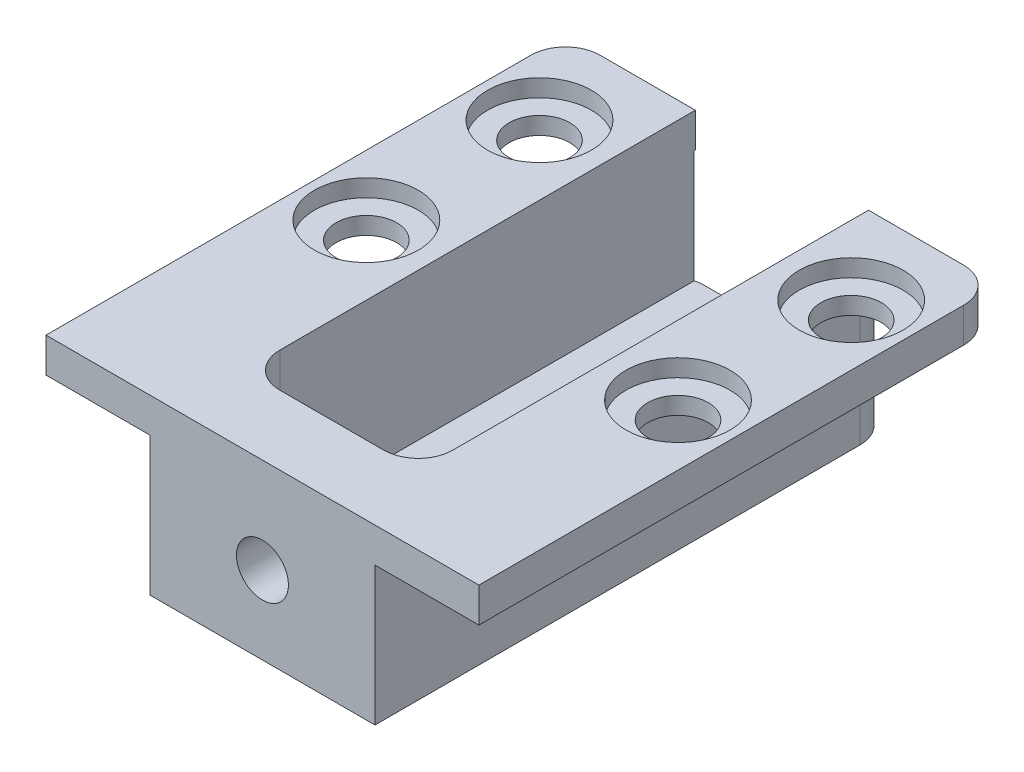
ISO-10303-21;
HEADER;
FILE_DESCRIPTION(('STEP AP214'),'2;1');
FILE_NAME('part.step','',(''),(''),'','','');
FILE_SCHEMA(('AUTOMOTIVE_DESIGN { 1 0 10303 214 1 1 1 1 }'));
ENDSEC;
DATA;
#1=APPLICATION_CONTEXT('core data for automotive mechanical design processes');
#2=APPLICATION_PROTOCOL_DEFINITION('international standard','automotive_design',2000,#1);
#3=PRODUCT_CONTEXT('',#1,'mechanical');
#4=PRODUCT('Part','Part','',(#3));
#5=PRODUCT_RELATED_PRODUCT_CATEGORY('part','',(#4));
#6=PRODUCT_DEFINITION_FORMATION('','',#4);
#7=PRODUCT_DEFINITION_CONTEXT('part definition',#1,'design');
#8=PRODUCT_DEFINITION('design','',#6,#7);
#9=PRODUCT_DEFINITION_SHAPE('','',#8);
#10=(LENGTH_UNIT() NAMED_UNIT(*) SI_UNIT(.MILLI.,.METRE.));
#11=(NAMED_UNIT(*) PLANE_ANGLE_UNIT() SI_UNIT($,.RADIAN.));
#12=(NAMED_UNIT(*) SI_UNIT($,.STERADIAN.) SOLID_ANGLE_UNIT());
#13=UNCERTAINTY_MEASURE_WITH_UNIT(LENGTH_MEASURE(1.E-05),#10,'distance_accuracy_value','');
#14=(GEOMETRIC_REPRESENTATION_CONTEXT(3) GLOBAL_UNCERTAINTY_ASSIGNED_CONTEXT((#13)) GLOBAL_UNIT_ASSIGNED_CONTEXT((#10,
#11,#12)) REPRESENTATION_CONTEXT('',''));
#15=CARTESIAN_POINT('',(0.,0.,0.));
#16=DIRECTION('',(0.,0.,1.));
#17=DIRECTION('',(1.,0.,0.));
#18=AXIS2_PLACEMENT_3D('',#15,#16,#17);
#19=CARTESIAN_POINT('',(-20.75,-6.,27.75));
#20=DIRECTION('',(0.,0.,1.));
#21=DIRECTION('',(1.,0.,0.));
#22=AXIS2_PLACEMENT_3D('',#19,#20,#21);
#23=PLANE('',#22);
#24=DIRECTION('',(1.,0.,0.));
#25=VECTOR('',#24,1.);
#26=CARTESIAN_POINT('',(-26.75,2.,27.75));
#27=LINE('',#26,#25);
#28=CARTESIAN_POINT('',(-28.25,2.,27.75));
#29=VERTEX_POINT('',#28);
#30=CARTESIAN_POINT('',(-22.75,2.,27.75));
#31=VERTEX_POINT('',#30);
#32=EDGE_CURVE('E667',#29,#31,#27,.T.);
#33=ORIENTED_EDGE('',*,*,#32,.F.);
#34=DIRECTION('',(0.,-1.,0.));
#35=VECTOR('',#34,1.);
#36=CARTESIAN_POINT('',(-28.25,4.,27.75));
#37=LINE('',#36,#35);
#38=CARTESIAN_POINT('',(-28.25,4.,27.75));
#39=VERTEX_POINT('',#38);
#40=EDGE_CURVE('E619',#39,#29,#37,.T.);
#41=ORIENTED_EDGE('',*,*,#40,.F.);
#42=DIRECTION('',(1.,0.,0.));
#43=VECTOR('',#42,1.);
#44=CARTESIAN_POINT('',(-20.75,4.,27.75));
#45=LINE('',#44,#43);
#46=CARTESIAN_POINT('',(-22.75,4.,27.75));
#47=VERTEX_POINT('',#46);
#48=EDGE_CURVE('E675',#39,#47,#45,.T.);
#49=ORIENTED_EDGE('',*,*,#48,.T.);
#50=DIRECTION('',(0.,1.,0.));
#51=VECTOR('',#50,1.);
#52=CARTESIAN_POINT('',(-22.75,2.,27.75));
#53=LINE('',#52,#51);
#54=EDGE_CURVE('E805',#47,#31,#53,.F.);
#55=ORIENTED_EDGE('',*,*,#54,.T.);
#56=EDGE_LOOP('',(#33,#41,#49,#55));
#57=FACE_BOUND('',#56,.T.);
#58=ADVANCED_FACE('F466',(#57),#23,.F.);
#59=DIRECTION('',(-1.,0.,0.));
#60=VECTOR('',#59,1.);
#61=CARTESIAN_POINT('',(-38.25,-4.5,27.75));
#62=LINE('',#61,#60);
#63=CARTESIAN_POINT('',(-28.75,-4.5,27.75));
#64=VERTEX_POINT('',#63);
#65=CARTESIAN_POINT('',(-37.75,-4.5,27.75));
#66=VERTEX_POINT('',#65);
#67=EDGE_CURVE('E707',#64,#66,#62,.T.);
#68=ORIENTED_EDGE('',*,*,#67,.F.);
#69=DIRECTION('',(0.,1.,0.));
#70=VECTOR('',#69,1.);
#71=CARTESIAN_POINT('',(-28.75,-6.,27.75));
#72=LINE('',#71,#70);
#73=CARTESIAN_POINT('',(-28.75,-6.,27.75));
#74=VERTEX_POINT('',#73);
#75=EDGE_CURVE('E814',#64,#74,#72,.F.);
#76=ORIENTED_EDGE('',*,*,#75,.T.);
#77=DIRECTION('',(1.,0.,0.));
#78=VECTOR('',#77,1.);
#79=CARTESIAN_POINT('',(-20.75,-6.,27.75));
#80=LINE('',#79,#78);
#81=CARTESIAN_POINT('',(-37.75,-6.,27.75));
#82=VERTEX_POINT('',#81);
#83=EDGE_CURVE('E684',#82,#74,#80,.T.);
#84=ORIENTED_EDGE('',*,*,#83,.F.);
#85=DIRECTION('',(0.,1.,0.));
#86=VECTOR('',#85,1.);
#87=CARTESIAN_POINT('',(-37.75,2.,27.75));
#88=LINE('',#87,#86);
#89=EDGE_CURVE('E735',#82,#66,#88,.T.);
#90=ORIENTED_EDGE('',*,*,#89,.T.);
#91=EDGE_LOOP('',(#68,#76,#84,#90));
#92=FACE_BOUND('',#91,.T.);
#93=ADVANCED_FACE('F877',(#92),#23,.F.);
#94=CARTESIAN_POINT('',(-24.25,-6.,32.75));
#95=DIRECTION('',(0.,1.,0.));
#96=DIRECTION('',(0.,0.,1.));
#97=AXIS2_PLACEMENT_3D('',#94,#95,#96);
#98=CYLINDRICAL_SURFACE('',#97,1.75);
#99=CARTESIAN_POINT('',(-24.25,2.,32.75));
#100=DIRECTION('',(0.,-1.,0.));
#101=DIRECTION('',(0.,0.,-1.));
#102=AXIS2_PLACEMENT_3D('',#99,#100,#101);
#103=CIRCLE('',#102,1.75);
#104=CARTESIAN_POINT('',(-24.25,2.,31.));
#105=VERTEX_POINT('',#104);
#106=EDGE_CURVE('E736',#105,#105,#103,.T.);
#107=ORIENTED_EDGE('',*,*,#106,.T.);
#108=EDGE_LOOP('',(#107));
#109=FACE_BOUND('',#108,.T.);
#110=CARTESIAN_POINT('',(-24.25,3.,32.75));
#111=DIRECTION('',(0.,1.,0.));
#112=DIRECTION('',(0.,0.,1.));
#113=AXIS2_PLACEMENT_3D('',#110,#111,#112);
#114=CIRCLE('',#113,1.75);
#115=CARTESIAN_POINT('',(-24.25,3.,34.5));
#116=VERTEX_POINT('',#115);
#117=EDGE_CURVE('E741',#116,#116,#114,.F.);
#118=ORIENTED_EDGE('',*,*,#117,.F.);
#119=EDGE_LOOP('',(#118));
#120=FACE_BOUND('',#119,.T.);
#121=ADVANCED_FACE('F903',(#109,#120),#98,.F.);
#122=CARTESIAN_POINT('',(-24.25,-6.,42.75));
#123=DIRECTION('',(0.,1.,0.));
#124=DIRECTION('',(0.,0.,1.));
#125=AXIS2_PLACEMENT_3D('',#122,#123,#124);
#126=CYLINDRICAL_SURFACE('',#125,1.75);
#127=CARTESIAN_POINT('',(-24.25,2.,42.75));
#128=DIRECTION('',(0.,-1.,0.));
#129=DIRECTION('',(0.,0.,-1.));
#130=AXIS2_PLACEMENT_3D('',#127,#128,#129);
#131=CIRCLE('',#130,1.75);
#132=CARTESIAN_POINT('',(-24.25,2.,41.));
#133=VERTEX_POINT('',#132);
#134=EDGE_CURVE('E740',#133,#133,#131,.T.);
#135=ORIENTED_EDGE('',*,*,#134,.T.);
#136=EDGE_LOOP('',(#135));
#137=FACE_BOUND('',#136,.T.);
#138=CARTESIAN_POINT('',(-24.25,3.,42.75));
#139=DIRECTION('',(0.,1.,0.));
#140=DIRECTION('',(0.,0.,1.));
#141=AXIS2_PLACEMENT_3D('',#138,#139,#140);
#142=CIRCLE('',#141,1.75);
#143=CARTESIAN_POINT('',(-24.25,3.,44.5));
#144=VERTEX_POINT('',#143);
#145=EDGE_CURVE('E755',#144,#144,#142,.F.);
#146=ORIENTED_EDGE('',*,*,#145,.F.);
#147=EDGE_LOOP('',(#146));
#148=FACE_BOUND('',#147,.T.);
#149=ADVANCED_FACE('F1149',(#137,#148),#126,.F.);
#150=CARTESIAN_POINT('',(-42.25,-6.,42.75));
#151=DIRECTION('',(0.,1.,0.));
#152=DIRECTION('',(0.,0.,1.));
#153=AXIS2_PLACEMENT_3D('',#150,#151,#152);
#154=CYLINDRICAL_SURFACE('',#153,1.75);
#155=CARTESIAN_POINT('',(-42.25,2.,42.75));
#156=DIRECTION('',(0.,-1.,0.));
#157=DIRECTION('',(0.,0.,-1.));
#158=AXIS2_PLACEMENT_3D('',#155,#156,#157);
#159=CIRCLE('',#158,1.75);
#160=CARTESIAN_POINT('',(-42.25,2.,41.));
#161=VERTEX_POINT('',#160);
#162=EDGE_CURVE('E745',#161,#161,#159,.T.);
#163=ORIENTED_EDGE('',*,*,#162,.T.);
#164=EDGE_LOOP('',(#163));
#165=FACE_BOUND('',#164,.T.);
#166=CARTESIAN_POINT('',(-42.25,3.,42.75));
#167=DIRECTION('',(0.,1.,0.));
#168=DIRECTION('',(0.,0.,1.));
#169=AXIS2_PLACEMENT_3D('',#166,#167,#168);
#170=CIRCLE('',#169,1.75);
#171=CARTESIAN_POINT('',(-42.25,3.,44.5));
#172=VERTEX_POINT('',#171);
#173=EDGE_CURVE('E750',#172,#172,#170,.F.);
#174=ORIENTED_EDGE('',*,*,#173,.F.);
#175=EDGE_LOOP('',(#174));
#176=FACE_BOUND('',#175,.T.);
#177=ADVANCED_FACE('F962',(#165,#176),#154,.F.);
#178=CARTESIAN_POINT('',(-42.25,-6.,32.75));
#179=DIRECTION('',(0.,1.,0.));
#180=DIRECTION('',(0.,0.,1.));
#181=AXIS2_PLACEMENT_3D('',#178,#179,#180);
#182=CYLINDRICAL_SURFACE('',#181,1.75);
#183=CARTESIAN_POINT('',(-42.25,2.,32.75));
#184=DIRECTION('',(0.,-1.,0.));
#185=DIRECTION('',(0.,0.,-1.));
#186=AXIS2_PLACEMENT_3D('',#183,#184,#185);
#187=CIRCLE('',#186,1.75);
#188=CARTESIAN_POINT('',(-42.25,2.,31.));
#189=VERTEX_POINT('',#188);
#190=EDGE_CURVE('E642',#189,#189,#187,.T.);
#191=ORIENTED_EDGE('',*,*,#190,.T.);
#192=EDGE_LOOP('',(#191));
#193=FACE_BOUND('',#192,.T.);
#194=CARTESIAN_POINT('',(-42.25,3.,32.75));
#195=DIRECTION('',(0.,1.,0.));
#196=DIRECTION('',(0.,0.,1.));
#197=AXIS2_PLACEMENT_3D('',#194,#195,#196);
#198=CIRCLE('',#197,1.75);
#199=CARTESIAN_POINT('',(-42.25,3.,34.5));
#200=VERTEX_POINT('',#199);
#201=EDGE_CURVE('E746',#200,#200,#198,.F.);
#202=ORIENTED_EDGE('',*,*,#201,.F.);
#203=EDGE_LOOP('',(#202));
#204=FACE_BOUND('',#203,.T.);
#205=ADVANCED_FACE('F956',(#193,#204),#182,.F.);
#206=CARTESIAN_POINT('',(0.,2.,0.));
#207=DIRECTION('',(0.,-1.,0.));
#208=DIRECTION('',(0.,0.,-1.));
#209=AXIS2_PLACEMENT_3D('',#206,#207,#208);
#210=PLANE('',#209);
#211=ORIENTED_EDGE('',*,*,#190,.F.);
#212=EDGE_LOOP('',(#211));
#213=FACE_BOUND('',#212,.T.);
#214=ORIENTED_EDGE('',*,*,#162,.F.);
#215=EDGE_LOOP('',(#214));
#216=FACE_BOUND('',#215,.T.);
#217=DIRECTION('',(0.,0.,-1.));
#218=VECTOR('',#217,1.);
#219=CARTESIAN_POINT('',(-45.75,2.,46.9436745409188));
#220=LINE('',#219,#218);
#221=CARTESIAN_POINT('',(-45.75,2.,57.75));
#222=VERTEX_POINT('',#221);
#223=CARTESIAN_POINT('',(-45.75,2.,29.75));
#224=VERTEX_POINT('',#223);
#225=EDGE_CURVE('E653',#222,#224,#220,.T.);
#226=ORIENTED_EDGE('',*,*,#225,.T.);
#227=CARTESIAN_POINT('',(-43.75,2.,29.75));
#228=DIRECTION('',(0.,-1.,0.));
#229=DIRECTION('',(0.,0.,-1.));
#230=AXIS2_PLACEMENT_3D('',#227,#228,#229);
#231=CIRCLE('',#230,2.);
#232=CARTESIAN_POINT('',(-43.75,2.,27.75));
#233=VERTEX_POINT('',#232);
#234=EDGE_CURVE('E798',#224,#233,#231,.T.);
#235=ORIENTED_EDGE('',*,*,#234,.T.);
#236=DIRECTION('',(1.,0.,0.));
#237=VECTOR('',#236,1.);
#238=CARTESIAN_POINT('',(-45.75,2.,27.75));
#239=LINE('',#238,#237);
#240=CARTESIAN_POINT('',(-38.25,2.,27.75));
#241=VERTEX_POINT('',#240);
#242=EDGE_CURVE('E679',#233,#241,#239,.T.);
#243=ORIENTED_EDGE('',*,*,#242,.T.);
#244=DIRECTION('',(0.,0.,-1.));
#245=VECTOR('',#244,1.);
#246=CARTESIAN_POINT('',(-38.25,2.,53.75));
#247=LINE('',#246,#245);
#248=CARTESIAN_POINT('',(-38.25,2.,27.8135083268963));
#249=VERTEX_POINT('',#248);
#250=EDGE_CURVE('E768',#249,#241,#247,.T.);
#251=ORIENTED_EDGE('',*,*,#250,.F.);
#252=CARTESIAN_POINT('',(-37.75,2.,29.75));
#253=DIRECTION('',(0.,-1.,0.));
#254=DIRECTION('',(0.,0.,-1.));
#255=AXIS2_PLACEMENT_3D('',#252,#253,#254);
#256=CIRCLE('',#255,2.);
#257=CARTESIAN_POINT('',(-39.75,2.,29.75));
#258=VERTEX_POINT('',#257);
#259=EDGE_CURVE('E782',#249,#258,#256,.F.);
#260=ORIENTED_EDGE('',*,*,#259,.T.);
#261=DIRECTION('',(0.,0.,1.));
#262=VECTOR('',#261,1.);
#263=CARTESIAN_POINT('',(-39.75,2.,27.75));
#264=LINE('',#263,#262);
#265=CARTESIAN_POINT('',(-39.75,2.,57.75));
#266=VERTEX_POINT('',#265);
#267=EDGE_CURVE('E668',#258,#266,#264,.T.);
#268=ORIENTED_EDGE('',*,*,#267,.T.);
#269=DIRECTION('',(-1.,0.,0.));
#270=VECTOR('',#269,1.);
#271=CARTESIAN_POINT('',(0.,2.,57.75));
#272=LINE('',#271,#270);
#273=EDGE_CURVE('E647',#266,#222,#272,.T.);
#274=ORIENTED_EDGE('',*,*,#273,.T.);
#275=EDGE_LOOP('',(#226,#235,#243,#251,#260,#268,#274));
#276=FACE_BOUND('',#275,.T.);
#277=ADVANCED_FACE('F943',(#213,#216,#276),#210,.T.);
#278=CARTESIAN_POINT('',(-45.75,468.51197727401,0.));
#279=DIRECTION('',(-1.,0.,0.));
#280=DIRECTION('',(0.,0.,1.));
#281=AXIS2_PLACEMENT_3D('',#278,#279,#280);
#282=PLANE('',#281);
#283=DIRECTION('',(0.,0.,-1.));
#284=VECTOR('',#283,1.);
#285=CARTESIAN_POINT('',(-45.75,4.,0.));
#286=LINE('',#285,#284);
#287=CARTESIAN_POINT('',(-45.75,4.,57.75));
#288=VERTEX_POINT('',#287);
#289=CARTESIAN_POINT('',(-45.75,4.,29.75));
#290=VERTEX_POINT('',#289);
#291=EDGE_CURVE('E694',#288,#290,#286,.T.);
#292=ORIENTED_EDGE('',*,*,#291,.T.);
#293=DIRECTION('',(0.,1.,0.));
#294=VECTOR('',#293,1.);
#295=CARTESIAN_POINT('',(-45.75,2.,29.75));
#296=LINE('',#295,#294);
#297=EDGE_CURVE('E795',#290,#224,#296,.F.);
#298=ORIENTED_EDGE('',*,*,#297,.T.);
#299=ORIENTED_EDGE('',*,*,#225,.F.);
#300=DIRECTION('',(0.,1.,0.));
#301=VECTOR('',#300,1.);
#302=CARTESIAN_POINT('',(-45.75,-37.0512483795333,57.75));
#303=LINE('',#302,#301);
#304=EDGE_CURVE('E658',#222,#288,#303,.T.);
#305=ORIENTED_EDGE('',*,*,#304,.T.);
#306=EDGE_LOOP('',(#292,#298,#299,#305));
#307=FACE_BOUND('',#306,.T.);
#308=ADVANCED_FACE('F915',(#307),#282,.T.);
#309=CARTESIAN_POINT('',(-20.75,468.51197727401,0.));
#310=DIRECTION('',(1.,0.,0.));
#311=DIRECTION('',(0.,0.,-1.));
#312=AXIS2_PLACEMENT_3D('',#309,#310,#311);
#313=PLANE('',#312);
#314=DIRECTION('',(0.,0.,1.));
#315=VECTOR('',#314,1.);
#316=CARTESIAN_POINT('',(-20.75,2.,27.75));
#317=LINE('',#316,#315);
#318=CARTESIAN_POINT('',(-20.75,2.,29.75));
#319=VERTEX_POINT('',#318);
#320=CARTESIAN_POINT('',(-20.75,2.,57.75));
#321=VERTEX_POINT('',#320);
#322=EDGE_CURVE('E672',#319,#321,#317,.T.);
#323=ORIENTED_EDGE('',*,*,#322,.F.);
#324=DIRECTION('',(0.,1.,0.));
#325=VECTOR('',#324,1.);
#326=CARTESIAN_POINT('',(-20.75,4.,29.75));
#327=LINE('',#326,#325);
#328=CARTESIAN_POINT('',(-20.75,4.,29.75));
#329=VERTEX_POINT('',#328);
#330=EDGE_CURVE('E801',#319,#329,#327,.T.);
#331=ORIENTED_EDGE('',*,*,#330,.T.);
#332=DIRECTION('',(0.,0.,1.));
#333=VECTOR('',#332,1.);
#334=CARTESIAN_POINT('',(-20.75,4.,0.));
#335=LINE('',#334,#333);
#336=CARTESIAN_POINT('',(-20.75,4.,57.75));
#337=VERTEX_POINT('',#336);
#338=EDGE_CURVE('E687',#329,#337,#335,.T.);
#339=ORIENTED_EDGE('',*,*,#338,.T.);
#340=DIRECTION('',(0.,1.,0.));
#341=VECTOR('',#340,1.);
#342=CARTESIAN_POINT('',(-20.75,-37.0512483795333,57.75));
#343=LINE('',#342,#341);
#344=EDGE_CURVE('E654',#321,#337,#343,.T.);
#345=ORIENTED_EDGE('',*,*,#344,.F.);
#346=EDGE_LOOP('',(#323,#331,#339,#345));
#347=FACE_BOUND('',#346,.T.);
#348=ADVANCED_FACE('F907',(#347),#313,.T.);
#349=ORIENTED_EDGE('',*,*,#242,.F.);
#350=DIRECTION('',(0.,1.,0.));
#351=VECTOR('',#350,1.);
#352=CARTESIAN_POINT('',(-43.75,4.,27.75));
#353=LINE('',#352,#351);
#354=CARTESIAN_POINT('',(-43.75,4.,27.75));
#355=VERTEX_POINT('',#354);
#356=EDGE_CURVE('E785',#233,#355,#353,.T.);
#357=ORIENTED_EDGE('',*,*,#356,.T.);
#358=CARTESIAN_POINT('',(-38.25,4.,27.75));
#359=VERTEX_POINT('',#358);
#360=EDGE_CURVE('E688',#355,#359,#45,.T.);
#361=ORIENTED_EDGE('',*,*,#360,.T.);
#362=DIRECTION('',(0.,-1.,0.));
#363=VECTOR('',#362,1.);
#364=CARTESIAN_POINT('',(-38.25,4.,27.75));
#365=LINE('',#364,#363);
#366=EDGE_CURVE('E714',#359,#241,#365,.T.);
#367=ORIENTED_EDGE('',*,*,#366,.T.);
#368=EDGE_LOOP('',(#349,#357,#361,#367));
#369=FACE_BOUND('',#368,.T.);
#370=ADVANCED_FACE('F899',(#369),#23,.F.);
#371=CARTESIAN_POINT('',(0.,4.,0.));
#372=DIRECTION('',(0.,1.,0.));
#373=DIRECTION('',(0.,0.,1.));
#374=AXIS2_PLACEMENT_3D('',#371,#372,#373);
#375=PLANE('',#374);
#376=CARTESIAN_POINT('',(-42.25,4.,42.75));
#377=DIRECTION('',(0.,1.,0.));
#378=DIRECTION('',(0.,0.,1.));
#379=AXIS2_PLACEMENT_3D('',#376,#377,#378);
#380=CIRCLE('',#379,3.);
#381=CARTESIAN_POINT('',(-42.25,4.,45.75));
#382=VERTEX_POINT('',#381);
#383=EDGE_CURVE('E1395',#382,#382,#380,.T.);
#384=ORIENTED_EDGE('',*,*,#383,.F.);
#385=EDGE_LOOP('',(#384));
#386=FACE_BOUND('',#385,.T.);
#387=CARTESIAN_POINT('',(-24.25,4.,42.75));
#388=DIRECTION('',(0.,1.,0.));
#389=DIRECTION('',(0.,0.,1.));
#390=AXIS2_PLACEMENT_3D('',#387,#388,#389);
#391=CIRCLE('',#390,3.);
#392=CARTESIAN_POINT('',(-24.25,4.,45.75));
#393=VERTEX_POINT('',#392);
#394=EDGE_CURVE('E1403',#393,#393,#391,.T.);
#395=ORIENTED_EDGE('',*,*,#394,.F.);
#396=EDGE_LOOP('',(#395));
#397=FACE_BOUND('',#396,.T.);
#398=CARTESIAN_POINT('',(-24.25,4.,32.75));
#399=DIRECTION('',(0.,1.,0.));
#400=DIRECTION('',(0.,0.,1.));
#401=AXIS2_PLACEMENT_3D('',#398,#399,#400);
#402=CIRCLE('',#401,3.);
#403=CARTESIAN_POINT('',(-24.25,4.,35.75));
#404=VERTEX_POINT('',#403);
#405=EDGE_CURVE('E1411',#404,#404,#402,.T.);
#406=ORIENTED_EDGE('',*,*,#405,.F.);
#407=EDGE_LOOP('',(#406));
#408=FACE_BOUND('',#407,.T.);
#409=CARTESIAN_POINT('',(-42.25,4.,32.75));
#410=DIRECTION('',(0.,1.,0.));
#411=DIRECTION('',(0.,0.,1.));
#412=AXIS2_PLACEMENT_3D('',#409,#410,#411);
#413=CIRCLE('',#412,3.);
#414=CARTESIAN_POINT('',(-42.25,4.,35.75));
#415=VERTEX_POINT('',#414);
#416=EDGE_CURVE('E1387',#415,#415,#413,.T.);
#417=ORIENTED_EDGE('',*,*,#416,.F.);
#418=EDGE_LOOP('',(#417));
#419=FACE_BOUND('',#418,.T.);
#420=ORIENTED_EDGE('',*,*,#360,.F.);
#421=CARTESIAN_POINT('',(-43.75,4.,29.75));
#422=DIRECTION('',(0.,1.,0.));
#423=DIRECTION('',(0.,0.,1.));
#424=AXIS2_PLACEMENT_3D('',#421,#422,#423);
#425=CIRCLE('',#424,2.);
#426=EDGE_CURVE('E792',#355,#290,#425,.T.);
#427=ORIENTED_EDGE('',*,*,#426,.T.);
#428=ORIENTED_EDGE('',*,*,#291,.F.);
#429=DIRECTION('',(-1.,0.,0.));
#430=VECTOR('',#429,1.);
#431=CARTESIAN_POINT('',(0.,4.,57.75));
#432=LINE('',#431,#430);
#433=EDGE_CURVE('E649',#337,#288,#432,.T.);
#434=ORIENTED_EDGE('',*,*,#433,.F.);
#435=ORIENTED_EDGE('',*,*,#338,.F.);
#436=CARTESIAN_POINT('',(-22.75,4.,29.75));
#437=DIRECTION('',(0.,1.,0.));
#438=DIRECTION('',(0.,0.,1.));
#439=AXIS2_PLACEMENT_3D('',#436,#437,#438);
#440=CIRCLE('',#439,2.);
#441=EDGE_CURVE('E789',#329,#47,#440,.T.);
#442=ORIENTED_EDGE('',*,*,#441,.T.);
#443=ORIENTED_EDGE('',*,*,#48,.F.);
#444=DIRECTION('',(0.,0.,-1.));
#445=VECTOR('',#444,1.);
#446=CARTESIAN_POINT('',(-28.25,4.,53.75));
#447=LINE('',#446,#445);
#448=CARTESIAN_POINT('',(-28.25,4.,51.75));
#449=VERTEX_POINT('',#448);
#450=EDGE_CURVE('E703',#449,#39,#447,.T.);
#451=ORIENTED_EDGE('',*,*,#450,.F.);
#452=CARTESIAN_POINT('',(-30.25,4.,51.75));
#453=DIRECTION('',(0.,1.,0.));
#454=DIRECTION('',(0.,0.,1.));
#455=AXIS2_PLACEMENT_3D('',#452,#453,#454);
#456=CIRCLE('',#455,2.);
#457=CARTESIAN_POINT('',(-30.25,4.,53.75));
#458=VERTEX_POINT('',#457);
#459=EDGE_CURVE('E475',#449,#458,#456,.F.);
#460=ORIENTED_EDGE('',*,*,#459,.T.);
#461=DIRECTION('',(1.,0.,0.));
#462=VECTOR('',#461,1.);
#463=CARTESIAN_POINT('',(-28.25,4.,53.75));
#464=LINE('',#463,#462);
#465=CARTESIAN_POINT('',(-36.25,4.,53.75));
#466=VERTEX_POINT('',#465);
#467=EDGE_CURVE('E706',#466,#458,#464,.T.);
#468=ORIENTED_EDGE('',*,*,#467,.F.);
#469=CARTESIAN_POINT('',(-36.25,4.,51.75));
#470=DIRECTION('',(0.,1.,0.));
#471=DIRECTION('',(0.,0.,1.));
#472=AXIS2_PLACEMENT_3D('',#469,#470,#471);
#473=CIRCLE('',#472,2.);
#474=CARTESIAN_POINT('',(-38.25,4.,51.75));
#475=VERTEX_POINT('',#474);
#476=EDGE_CURVE('E14',#466,#475,#473,.F.);
#477=ORIENTED_EDGE('',*,*,#476,.T.);
#478=DIRECTION('',(0.,0.,1.));
#479=VECTOR('',#478,1.);
#480=CARTESIAN_POINT('',(-38.25,4.,53.75));
#481=LINE('',#480,#479);
#482=EDGE_CURVE('E711',#359,#475,#481,.T.);
#483=ORIENTED_EDGE('',*,*,#482,.F.);
#484=EDGE_LOOP('',(#420,#427,#428,#434,#435,#442,#443,#451,#460,#468,#477,#483));
#485=FACE_BOUND('',#484,.T.);
#486=ADVANCED_FACE('F855',(#386,#397,#408,#419,#485),#375,.T.);
#487=CARTESIAN_POINT('',(-26.75,-6.,0.));
#488=DIRECTION('',(-1.,0.,0.));
#489=DIRECTION('',(0.,0.,1.));
#490=AXIS2_PLACEMENT_3D('',#487,#488,#489);
#491=PLANE('',#490);
#492=DIRECTION('',(0.,0.,1.));
#493=VECTOR('',#492,1.);
#494=CARTESIAN_POINT('',(-26.75,-6.,0.));
#495=LINE('',#494,#493);
#496=CARTESIAN_POINT('',(-26.75,-6.,29.75));
#497=VERTEX_POINT('',#496);
#498=CARTESIAN_POINT('',(-26.75,-6.,57.75));
#499=VERTEX_POINT('',#498);
#500=EDGE_CURVE('E605',#497,#499,#495,.T.);
#501=ORIENTED_EDGE('',*,*,#500,.F.);
#502=DIRECTION('',(0.,1.,0.));
#503=VECTOR('',#502,1.);
#504=CARTESIAN_POINT('',(-26.75,-6.,29.75));
#505=LINE('',#504,#503);
#506=CARTESIAN_POINT('',(-26.75,2.,29.75));
#507=VERTEX_POINT('',#506);
#508=EDGE_CURVE('E811',#497,#507,#505,.T.);
#509=ORIENTED_EDGE('',*,*,#508,.T.);
#510=DIRECTION('',(0.,0.,-1.));
#511=VECTOR('',#510,1.);
#512=CARTESIAN_POINT('',(-26.75,2.,56.3209787263247));
#513=LINE('',#512,#511);
#514=CARTESIAN_POINT('',(-26.75,2.,57.75));
#515=VERTEX_POINT('',#514);
#516=EDGE_CURVE('E625',#515,#507,#513,.T.);
#517=ORIENTED_EDGE('',*,*,#516,.F.);
#518=DIRECTION('',(0.,-1.,0.));
#519=VECTOR('',#518,1.);
#520=CARTESIAN_POINT('',(-26.75,15.2625505647693,57.75));
#521=LINE('',#520,#519);
#522=EDGE_CURVE('E622',#515,#499,#521,.T.);
#523=ORIENTED_EDGE('',*,*,#522,.T.);
#524=EDGE_LOOP('',(#501,#509,#517,#523));
#525=FACE_BOUND('',#524,.T.);
#526=ADVANCED_FACE('F623',(#525),#491,.F.);
#527=CARTESIAN_POINT('',(-39.75,-6.,0.));
#528=DIRECTION('',(-1.,0.,0.));
#529=DIRECTION('',(0.,0.,1.));
#530=AXIS2_PLACEMENT_3D('',#527,#528,#529);
#531=PLANE('',#530);
#532=ORIENTED_EDGE('',*,*,#267,.F.);
#533=DIRECTION('',(0.,1.,0.));
#534=VECTOR('',#533,1.);
#535=CARTESIAN_POINT('',(-39.75,-6.,29.75));
#536=LINE('',#535,#534);
#537=CARTESIAN_POINT('',(-39.75,-6.,29.75));
#538=VERTEX_POINT('',#537);
#539=EDGE_CURVE('E776',#258,#538,#536,.F.);
#540=ORIENTED_EDGE('',*,*,#539,.T.);
#541=DIRECTION('',(0.,0.,1.));
#542=VECTOR('',#541,1.);
#543=CARTESIAN_POINT('',(-39.75,-6.,0.));
#544=LINE('',#543,#542);
#545=CARTESIAN_POINT('',(-39.75,-6.,57.75));
#546=VERTEX_POINT('',#545);
#547=EDGE_CURVE('E618',#538,#546,#544,.T.);
#548=ORIENTED_EDGE('',*,*,#547,.T.);
#549=DIRECTION('',(0.,-1.,0.));
#550=VECTOR('',#549,1.);
#551=CARTESIAN_POINT('',(-39.75,15.2625505647693,57.75));
#552=LINE('',#551,#550);
#553=EDGE_CURVE('E630',#266,#546,#552,.T.);
#554=ORIENTED_EDGE('',*,*,#553,.F.);
#555=EDGE_LOOP('',(#532,#540,#548,#554));
#556=FACE_BOUND('',#555,.T.);
#557=ADVANCED_FACE('F989',(#556),#531,.T.);
#558=CARTESIAN_POINT('',(0.,-6.,0.));
#559=DIRECTION('',(0.,-1.,0.));
#560=DIRECTION('',(0.,0.,1.));
#561=AXIS2_PLACEMENT_3D('',#558,#559,#560);
#562=PLANE('',#561);
#563=ORIENTED_EDGE('',*,*,#83,.T.);
#564=CARTESIAN_POINT('',(-28.75,-6.,29.75));
#565=DIRECTION('',(0.,-1.,0.));
#566=DIRECTION('',(0.,0.,-1.));
#567=AXIS2_PLACEMENT_3D('',#564,#565,#566);
#568=CIRCLE('',#567,2.);
#569=EDGE_CURVE('E613',#74,#497,#568,.T.);
#570=ORIENTED_EDGE('',*,*,#569,.T.);
#571=ORIENTED_EDGE('',*,*,#500,.T.);
#572=DIRECTION('',(-1.,0.,0.));
#573=VECTOR('',#572,1.);
#574=CARTESIAN_POINT('',(-39.75,-6.,57.75));
#575=LINE('',#574,#573);
#576=EDGE_CURVE('E611',#499,#546,#575,.T.);
#577=ORIENTED_EDGE('',*,*,#576,.T.);
#578=ORIENTED_EDGE('',*,*,#547,.F.);
#579=CARTESIAN_POINT('',(-37.75,-6.,29.75));
#580=DIRECTION('',(0.,-1.,0.));
#581=DIRECTION('',(0.,0.,-1.));
#582=AXIS2_PLACEMENT_3D('',#579,#580,#581);
#583=CIRCLE('',#582,2.);
#584=EDGE_CURVE('E779',#538,#82,#583,.T.);
#585=ORIENTED_EDGE('',*,*,#584,.T.);
#586=EDGE_LOOP('',(#563,#570,#571,#577,#578,#585));
#587=FACE_BOUND('',#586,.T.);
#588=ADVANCED_FACE('F608',(#587),#562,.T.);
#589=CARTESIAN_POINT('',(-28.25,4.,53.75));
#590=DIRECTION('',(-1.,0.,0.));
#591=DIRECTION('',(0.,0.,1.));
#592=AXIS2_PLACEMENT_3D('',#589,#590,#591);
#593=PLANE('',#592);
#594=DIRECTION('',(0.,0.,-1.));
#595=VECTOR('',#594,1.);
#596=CARTESIAN_POINT('',(-28.25,-4.5,53.75));
#597=LINE('',#596,#595);
#598=CARTESIAN_POINT('',(-28.25,-4.5,51.75));
#599=VERTEX_POINT('',#598);
#600=CARTESIAN_POINT('',(-28.25,-4.5,27.8135083268963));
#601=VERTEX_POINT('',#600);
#602=EDGE_CURVE('E702',#599,#601,#597,.T.);
#603=ORIENTED_EDGE('',*,*,#602,.F.);
#604=DIRECTION('',(0.,-1.,0.));
#605=VECTOR('',#604,1.);
#606=CARTESIAN_POINT('',(-28.25,4.,51.75));
#607=LINE('',#606,#605);
#608=EDGE_CURVE('E488',#599,#449,#607,.F.);
#609=ORIENTED_EDGE('',*,*,#608,.T.);
#610=ORIENTED_EDGE('',*,*,#450,.T.);
#611=ORIENTED_EDGE('',*,*,#40,.T.);
#612=DIRECTION('',(0.,0.,1.));
#613=VECTOR('',#612,1.);
#614=CARTESIAN_POINT('',(-28.25,2.,53.75));
#615=LINE('',#614,#613);
#616=CARTESIAN_POINT('',(-28.25,2.,27.8135083268963));
#617=VERTEX_POINT('',#616);
#618=EDGE_CURVE('E821',#29,#617,#615,.T.);
#619=ORIENTED_EDGE('',*,*,#618,.T.);
#620=DIRECTION('',(0.,1.,0.));
#621=VECTOR('',#620,1.);
#622=CARTESIAN_POINT('',(-28.25,-6.,27.8135083268963));
#623=LINE('',#622,#621);
#624=EDGE_CURVE('E817',#617,#601,#623,.F.);
#625=ORIENTED_EDGE('',*,*,#624,.T.);
#626=EDGE_LOOP('',(#603,#609,#610,#611,#619,#625));
#627=FACE_BOUND('',#626,.T.);
#628=ADVANCED_FACE('F867',(#627),#593,.T.);
#629=CARTESIAN_POINT('',(-38.25,4.,53.75));
#630=DIRECTION('',(1.,0.,0.));
#631=DIRECTION('',(0.,0.,-1.));
#632=AXIS2_PLACEMENT_3D('',#629,#630,#631);
#633=PLANE('',#632);
#634=ORIENTED_EDGE('',*,*,#482,.T.);
#635=DIRECTION('',(0.,-1.,0.));
#636=VECTOR('',#635,1.);
#637=CARTESIAN_POINT('',(-38.25,-4.5,51.75));
#638=LINE('',#637,#636);
#639=CARTESIAN_POINT('',(-38.25,-4.5,51.75));
#640=VERTEX_POINT('',#639);
#641=EDGE_CURVE('E848',#475,#640,#638,.T.);
#642=ORIENTED_EDGE('',*,*,#641,.T.);
#643=DIRECTION('',(0.,0.,1.));
#644=VECTOR('',#643,1.);
#645=CARTESIAN_POINT('',(-38.25,-4.5,53.75));
#646=LINE('',#645,#644);
#647=CARTESIAN_POINT('',(-38.25,-4.5,27.8135083268963));
#648=VERTEX_POINT('',#647);
#649=EDGE_CURVE('E721',#648,#640,#646,.T.);
#650=ORIENTED_EDGE('',*,*,#649,.F.);
#651=DIRECTION('',(0.,-1.,0.));
#652=VECTOR('',#651,1.);
#653=CARTESIAN_POINT('',(-38.25,-6.,27.8135083268963));
#654=LINE('',#653,#652);
#655=EDGE_CURVE('E772',#648,#249,#654,.F.);
#656=ORIENTED_EDGE('',*,*,#655,.T.);
#657=ORIENTED_EDGE('',*,*,#250,.T.);
#658=ORIENTED_EDGE('',*,*,#366,.F.);
#659=EDGE_LOOP('',(#634,#642,#650,#656,#657,#658));
#660=FACE_BOUND('',#659,.T.);
#661=ADVANCED_FACE('F888',(#660),#633,.T.);
#662=CARTESIAN_POINT('',(-28.25,4.,53.75));
#663=DIRECTION('',(0.,0.,-1.));
#664=DIRECTION('',(-1.,0.,0.));
#665=AXIS2_PLACEMENT_3D('',#662,#663,#664);
#666=PLANE('',#665);
#667=ORIENTED_EDGE('',*,*,#467,.T.);
#668=DIRECTION('',(0.,-1.,0.));
#669=VECTOR('',#668,1.);
#670=CARTESIAN_POINT('',(-30.25,-4.5,53.75));
#671=LINE('',#670,#669);
#672=CARTESIAN_POINT('',(-30.25,-4.5,53.75));
#673=VERTEX_POINT('',#672);
#674=EDGE_CURVE('E836',#458,#673,#671,.T.);
#675=ORIENTED_EDGE('',*,*,#674,.T.);
#676=DIRECTION('',(1.,0.,0.));
#677=VECTOR('',#676,1.);
#678=CARTESIAN_POINT('',(-28.25,-4.5,53.75));
#679=LINE('',#678,#677);
#680=CARTESIAN_POINT('',(-36.25,-4.5,53.75));
#681=VERTEX_POINT('',#680);
#682=EDGE_CURVE('E717',#681,#673,#679,.T.);
#683=ORIENTED_EDGE('',*,*,#682,.F.);
#684=DIRECTION('',(0.,-1.,0.));
#685=VECTOR('',#684,1.);
#686=CARTESIAN_POINT('',(-36.25,4.,53.75));
#687=LINE('',#686,#685);
#688=EDGE_CURVE('E833',#681,#466,#687,.F.);
#689=ORIENTED_EDGE('',*,*,#688,.T.);
#690=EDGE_LOOP('',(#667,#675,#683,#689));
#691=FACE_BOUND('',#690,.T.);
#692=CARTESIAN_POINT('',(-33.25,-1.5,53.75));
#693=DIRECTION('',(0.,0.,1.));
#694=DIRECTION('',(1.,0.,0.));
#695=AXIS2_PLACEMENT_3D('',#692,#693,#694);
#696=CIRCLE('',#695,1.5);
#697=CARTESIAN_POINT('',(-31.75,-1.5,53.75));
#698=VERTEX_POINT('',#697);
#699=EDGE_CURVE('E698',#698,#698,#696,.T.);
#700=ORIENTED_EDGE('',*,*,#699,.T.);
#701=EDGE_LOOP('',(#700));
#702=FACE_BOUND('',#701,.T.);
#703=ADVANCED_FACE('F860',(#691,#702),#666,.T.);
#704=CARTESIAN_POINT('',(0.,-4.5,0.));
#705=DIRECTION('',(0.,1.,0.));
#706=DIRECTION('',(0.,0.,-1.));
#707=AXIS2_PLACEMENT_3D('',#704,#705,#706);
#708=PLANE('',#707);
#709=ORIENTED_EDGE('',*,*,#682,.T.);
#710=CARTESIAN_POINT('',(-30.25,-4.5,51.75));
#711=DIRECTION('',(0.,1.,0.));
#712=DIRECTION('',(0.,0.,1.));
#713=AXIS2_PLACEMENT_3D('',#710,#711,#712);
#714=CIRCLE('',#713,2.);
#715=EDGE_CURVE('E843',#673,#599,#714,.T.);
#716=ORIENTED_EDGE('',*,*,#715,.T.);
#717=ORIENTED_EDGE('',*,*,#602,.T.);
#718=CARTESIAN_POINT('',(-28.75,-4.5,29.75));
#719=DIRECTION('',(0.,1.,0.));
#720=DIRECTION('',(0.,0.,1.));
#721=AXIS2_PLACEMENT_3D('',#718,#719,#720);
#722=CIRCLE('',#721,2.);
#723=EDGE_CURVE('E825',#601,#64,#722,.T.);
#724=ORIENTED_EDGE('',*,*,#723,.T.);
#725=ORIENTED_EDGE('',*,*,#67,.T.);
#726=CARTESIAN_POINT('',(-37.75,-4.5,29.75));
#727=DIRECTION('',(0.,1.,0.));
#728=DIRECTION('',(0.,0.,1.));
#729=AXIS2_PLACEMENT_3D('',#726,#727,#728);
#730=CIRCLE('',#729,2.);
#731=EDGE_CURVE('E765',#66,#648,#730,.T.);
#732=ORIENTED_EDGE('',*,*,#731,.T.);
#733=ORIENTED_EDGE('',*,*,#649,.T.);
#734=CARTESIAN_POINT('',(-36.25,-4.5,51.75));
#735=DIRECTION('',(0.,1.,0.));
#736=DIRECTION('',(0.,0.,1.));
#737=AXIS2_PLACEMENT_3D('',#734,#735,#736);
#738=CIRCLE('',#737,2.);
#739=EDGE_CURVE('E840',#640,#681,#738,.T.);
#740=ORIENTED_EDGE('',*,*,#739,.T.);
#741=EDGE_LOOP('',(#709,#716,#717,#724,#725,#732,#733,#740));
#742=FACE_BOUND('',#741,.T.);
#743=ADVANCED_FACE('F866',(#742),#708,.T.);
#744=CARTESIAN_POINT('',(-33.25,-1.5,57.25));
#745=DIRECTION('',(0.,0.,-1.));
#746=DIRECTION('',(-1.,0.,0.));
#747=AXIS2_PLACEMENT_3D('',#744,#745,#746);
#748=CYLINDRICAL_SURFACE('',#747,1.5);
#749=ORIENTED_EDGE('',*,*,#699,.F.);
#750=EDGE_LOOP('',(#749));
#751=FACE_BOUND('',#750,.T.);
#752=CARTESIAN_POINT('',(-33.25,-1.5,57.75));
#753=DIRECTION('',(0.,0.,-1.));
#754=DIRECTION('',(-1.,0.,0.));
#755=AXIS2_PLACEMENT_3D('',#752,#753,#754);
#756=CIRCLE('',#755,1.5);
#757=CARTESIAN_POINT('',(-34.75,-1.5,57.75));
#758=VERTEX_POINT('',#757);
#759=EDGE_CURVE('E637',#758,#758,#756,.T.);
#760=ORIENTED_EDGE('',*,*,#759,.F.);
#761=EDGE_LOOP('',(#760));
#762=FACE_BOUND('',#761,.T.);
#763=ADVANCED_FACE('F941',(#751,#762),#748,.F.);
#764=ORIENTED_EDGE('',*,*,#134,.F.);
#765=EDGE_LOOP('',(#764));
#766=FACE_BOUND('',#765,.T.);
#767=ORIENTED_EDGE('',*,*,#106,.F.);
#768=EDGE_LOOP('',(#767));
#769=FACE_BOUND('',#768,.T.);
#770=ORIENTED_EDGE('',*,*,#32,.T.);
#771=CARTESIAN_POINT('',(-22.75,2.,29.75));
#772=DIRECTION('',(0.,-1.,0.));
#773=DIRECTION('',(0.,0.,-1.));
#774=AXIS2_PLACEMENT_3D('',#771,#772,#773);
#775=CIRCLE('',#774,2.);
#776=EDGE_CURVE('E808',#31,#319,#775,.T.);
#777=ORIENTED_EDGE('',*,*,#776,.T.);
#778=ORIENTED_EDGE('',*,*,#322,.T.);
#779=EDGE_CURVE('E655',#321,#515,#272,.T.);
#780=ORIENTED_EDGE('',*,*,#779,.T.);
#781=ORIENTED_EDGE('',*,*,#516,.T.);
#782=CARTESIAN_POINT('',(-28.75,2.,29.75));
#783=DIRECTION('',(0.,-1.,0.));
#784=DIRECTION('',(0.,0.,-1.));
#785=AXIS2_PLACEMENT_3D('',#782,#783,#784);
#786=CIRCLE('',#785,2.);
#787=EDGE_CURVE('E830',#507,#617,#786,.F.);
#788=ORIENTED_EDGE('',*,*,#787,.T.);
#789=ORIENTED_EDGE('',*,*,#618,.F.);
#790=EDGE_LOOP('',(#770,#777,#778,#780,#781,#788,#789));
#791=FACE_BOUND('',#790,.T.);
#792=ADVANCED_FACE('F939',(#766,#769,#791),#210,.T.);
#793=CARTESIAN_POINT('',(0.,-37.0512483795333,57.75));
#794=DIRECTION('',(0.,0.,-1.));
#795=DIRECTION('',(-1.,0.,0.));
#796=AXIS2_PLACEMENT_3D('',#793,#794,#795);
#797=PLANE('',#796);
#798=ORIENTED_EDGE('',*,*,#759,.T.);
#799=EDGE_LOOP('',(#798));
#800=FACE_BOUND('',#799,.T.);
#801=ORIENTED_EDGE('',*,*,#779,.F.);
#802=ORIENTED_EDGE('',*,*,#344,.T.);
#803=ORIENTED_EDGE('',*,*,#433,.T.);
#804=ORIENTED_EDGE('',*,*,#304,.F.);
#805=ORIENTED_EDGE('',*,*,#273,.F.);
#806=ORIENTED_EDGE('',*,*,#553,.T.);
#807=ORIENTED_EDGE('',*,*,#576,.F.);
#808=ORIENTED_EDGE('',*,*,#522,.F.);
#809=EDGE_LOOP('',(#801,#802,#803,#804,#805,#806,#807,#808));
#810=FACE_BOUND('',#809,.T.);
#811=ADVANCED_FACE('F633',(#800,#810),#797,.F.);
#812=CARTESIAN_POINT('',(-42.25,3.,32.75));
#813=DIRECTION('',(0.,1.,0.));
#814=DIRECTION('',(0.,0.,1.));
#815=AXIS2_PLACEMENT_3D('',#812,#813,#814);
#816=PLANE('',#815);
#817=CARTESIAN_POINT('',(-42.25,3.,32.75));
#818=DIRECTION('',(0.,1.,0.));
#819=DIRECTION('',(0.,0.,1.));
#820=AXIS2_PLACEMENT_3D('',#817,#818,#819);
#821=CIRCLE('',#820,3.);
#822=CARTESIAN_POINT('',(-42.25,3.,35.75));
#823=VERTEX_POINT('',#822);
#824=EDGE_CURVE('E751',#823,#823,#821,.T.);
#825=ORIENTED_EDGE('',*,*,#824,.T.);
#826=EDGE_LOOP('',(#825));
#827=FACE_BOUND('',#826,.T.);
#828=ORIENTED_EDGE('',*,*,#201,.T.);
#829=EDGE_LOOP('',(#828));
#830=FACE_BOUND('',#829,.T.);
#831=ADVANCED_FACE('F948',(#827,#830),#816,.T.);
#832=CARTESIAN_POINT('',(-42.25,3.,32.75));
#833=DIRECTION('',(0.,1.,0.));
#834=DIRECTION('',(0.,0.,1.));
#835=AXIS2_PLACEMENT_3D('',#832,#833,#834);
#836=CYLINDRICAL_SURFACE('',#835,3.);
#837=ORIENTED_EDGE('',*,*,#824,.F.);
#838=EDGE_LOOP('',(#837));
#839=FACE_BOUND('',#838,.T.);
#840=ORIENTED_EDGE('',*,*,#416,.T.);
#841=EDGE_LOOP('',(#840));
#842=FACE_BOUND('',#841,.T.);
#843=ADVANCED_FACE('F1120',(#839,#842),#836,.F.);
#844=CARTESIAN_POINT('',(-42.25,3.,42.75));
#845=DIRECTION('',(0.,1.,0.));
#846=DIRECTION('',(0.,0.,1.));
#847=AXIS2_PLACEMENT_3D('',#844,#845,#846);
#848=PLANE('',#847);
#849=CARTESIAN_POINT('',(-42.25,3.,42.75));
#850=DIRECTION('',(0.,1.,0.));
#851=DIRECTION('',(0.,0.,1.));
#852=AXIS2_PLACEMENT_3D('',#849,#850,#851);
#853=CIRCLE('',#852,3.);
#854=CARTESIAN_POINT('',(-42.25,3.,45.75));
#855=VERTEX_POINT('',#854);
#856=EDGE_CURVE('E1399',#855,#855,#853,.T.);
#857=ORIENTED_EDGE('',*,*,#856,.T.);
#858=EDGE_LOOP('',(#857));
#859=FACE_BOUND('',#858,.T.);
#860=ORIENTED_EDGE('',*,*,#173,.T.);
#861=EDGE_LOOP('',(#860));
#862=FACE_BOUND('',#861,.T.);
#863=ADVANCED_FACE('F1110',(#859,#862),#848,.T.);
#864=CARTESIAN_POINT('',(-42.25,3.,42.75));
#865=DIRECTION('',(0.,1.,0.));
#866=DIRECTION('',(0.,0.,1.));
#867=AXIS2_PLACEMENT_3D('',#864,#865,#866);
#868=CYLINDRICAL_SURFACE('',#867,3.);
#869=ORIENTED_EDGE('',*,*,#856,.F.);
#870=EDGE_LOOP('',(#869));
#871=FACE_BOUND('',#870,.T.);
#872=ORIENTED_EDGE('',*,*,#383,.T.);
#873=EDGE_LOOP('',(#872));
#874=FACE_BOUND('',#873,.T.);
#875=ADVANCED_FACE('F1100',(#871,#874),#868,.F.);
#876=CARTESIAN_POINT('',(-24.25,3.,42.75));
#877=DIRECTION('',(0.,1.,0.));
#878=DIRECTION('',(0.,0.,1.));
#879=AXIS2_PLACEMENT_3D('',#876,#877,#878);
#880=PLANE('',#879);
#881=CARTESIAN_POINT('',(-24.25,3.,42.75));
#882=DIRECTION('',(0.,1.,0.));
#883=DIRECTION('',(0.,0.,1.));
#884=AXIS2_PLACEMENT_3D('',#881,#882,#883);
#885=CIRCLE('',#884,3.);
#886=CARTESIAN_POINT('',(-24.25,3.,45.75));
#887=VERTEX_POINT('',#886);
#888=EDGE_CURVE('E1407',#887,#887,#885,.T.);
#889=ORIENTED_EDGE('',*,*,#888,.T.);
#890=EDGE_LOOP('',(#889));
#891=FACE_BOUND('',#890,.T.);
#892=ORIENTED_EDGE('',*,*,#145,.T.);
#893=EDGE_LOOP('',(#892));
#894=FACE_BOUND('',#893,.T.);
#895=ADVANCED_FACE('F1090',(#891,#894),#880,.T.);
#896=CARTESIAN_POINT('',(-24.25,3.,42.75));
#897=DIRECTION('',(0.,1.,0.));
#898=DIRECTION('',(0.,0.,1.));
#899=AXIS2_PLACEMENT_3D('',#896,#897,#898);
#900=CYLINDRICAL_SURFACE('',#899,3.);
#901=ORIENTED_EDGE('',*,*,#888,.F.);
#902=EDGE_LOOP('',(#901));
#903=FACE_BOUND('',#902,.T.);
#904=ORIENTED_EDGE('',*,*,#394,.T.);
#905=EDGE_LOOP('',(#904));
#906=FACE_BOUND('',#905,.T.);
#907=ADVANCED_FACE('F1080',(#903,#906),#900,.F.);
#908=CARTESIAN_POINT('',(-24.25,3.,32.75));
#909=DIRECTION('',(0.,1.,0.));
#910=DIRECTION('',(0.,0.,1.));
#911=AXIS2_PLACEMENT_3D('',#908,#909,#910);
#912=PLANE('',#911);
#913=CARTESIAN_POINT('',(-24.25,3.,32.75));
#914=DIRECTION('',(0.,1.,0.));
#915=DIRECTION('',(0.,0.,1.));
#916=AXIS2_PLACEMENT_3D('',#913,#914,#915);
#917=CIRCLE('',#916,3.);
#918=CARTESIAN_POINT('',(-24.25,3.,35.75));
#919=VERTEX_POINT('',#918);
#920=EDGE_CURVE('E1391',#919,#919,#917,.T.);
#921=ORIENTED_EDGE('',*,*,#920,.T.);
#922=EDGE_LOOP('',(#921));
#923=FACE_BOUND('',#922,.T.);
#924=ORIENTED_EDGE('',*,*,#117,.T.);
#925=EDGE_LOOP('',(#924));
#926=FACE_BOUND('',#925,.T.);
#927=ADVANCED_FACE('F1071',(#923,#926),#912,.T.);
#928=CARTESIAN_POINT('',(-24.25,3.,32.75));
#929=DIRECTION('',(0.,1.,0.));
#930=DIRECTION('',(0.,0.,1.));
#931=AXIS2_PLACEMENT_3D('',#928,#929,#930);
#932=CYLINDRICAL_SURFACE('',#931,3.);
#933=ORIENTED_EDGE('',*,*,#920,.F.);
#934=EDGE_LOOP('',(#933));
#935=FACE_BOUND('',#934,.T.);
#936=ORIENTED_EDGE('',*,*,#405,.T.);
#937=EDGE_LOOP('',(#936));
#938=FACE_BOUND('',#937,.T.);
#939=ADVANCED_FACE('F1002',(#935,#938),#932,.F.);
#940=CARTESIAN_POINT('',(-37.75,-6.,29.75));
#941=DIRECTION('',(0.,-1.,0.));
#942=DIRECTION('',(0.,0.,-1.));
#943=AXIS2_PLACEMENT_3D('',#940,#941,#942);
#944=CYLINDRICAL_SURFACE('',#943,2.);
#945=ORIENTED_EDGE('',*,*,#584,.F.);
#946=ORIENTED_EDGE('',*,*,#539,.F.);
#947=ORIENTED_EDGE('',*,*,#259,.F.);
#948=ORIENTED_EDGE('',*,*,#655,.F.);
#949=ORIENTED_EDGE('',*,*,#731,.F.);
#950=ORIENTED_EDGE('',*,*,#89,.F.);
#951=EDGE_LOOP('',(#945,#946,#947,#948,#949,#950));
#952=FACE_BOUND('',#951,.T.);
#953=ADVANCED_FACE('F882',(#952),#944,.T.);
#954=CARTESIAN_POINT('',(-43.75,-6.,29.75));
#955=DIRECTION('',(0.,-1.,0.));
#956=DIRECTION('',(0.,0.,-1.));
#957=AXIS2_PLACEMENT_3D('',#954,#955,#956);
#958=CYLINDRICAL_SURFACE('',#957,2.);
#959=ORIENTED_EDGE('',*,*,#234,.F.);
#960=ORIENTED_EDGE('',*,*,#297,.F.);
#961=ORIENTED_EDGE('',*,*,#426,.F.);
#962=ORIENTED_EDGE('',*,*,#356,.F.);
#963=EDGE_LOOP('',(#959,#960,#961,#962));
#964=FACE_BOUND('',#963,.T.);
#965=ADVANCED_FACE('F923',(#964),#958,.T.);
#966=CARTESIAN_POINT('',(-22.75,468.51197727401,29.75));
#967=DIRECTION('',(0.,-1.,0.));
#968=DIRECTION('',(0.,0.,-1.));
#969=AXIS2_PLACEMENT_3D('',#966,#967,#968);
#970=CYLINDRICAL_SURFACE('',#969,2.);
#971=ORIENTED_EDGE('',*,*,#776,.F.);
#972=ORIENTED_EDGE('',*,*,#54,.F.);
#973=ORIENTED_EDGE('',*,*,#441,.F.);
#974=ORIENTED_EDGE('',*,*,#330,.F.);
#975=EDGE_LOOP('',(#971,#972,#973,#974));
#976=FACE_BOUND('',#975,.T.);
#977=ADVANCED_FACE('F935',(#976),#970,.T.);
#978=CARTESIAN_POINT('',(-28.75,-6.,29.75));
#979=DIRECTION('',(0.,1.,0.));
#980=DIRECTION('',(0.,0.,1.));
#981=AXIS2_PLACEMENT_3D('',#978,#979,#980);
#982=CYLINDRICAL_SURFACE('',#981,2.);
#983=ORIENTED_EDGE('',*,*,#723,.F.);
#984=ORIENTED_EDGE('',*,*,#624,.F.);
#985=ORIENTED_EDGE('',*,*,#787,.F.);
#986=ORIENTED_EDGE('',*,*,#508,.F.);
#987=ORIENTED_EDGE('',*,*,#569,.F.);
#988=ORIENTED_EDGE('',*,*,#75,.F.);
#989=EDGE_LOOP('',(#983,#984,#985,#986,#987,#988));
#990=FACE_BOUND('',#989,.T.);
#991=ADVANCED_FACE('F873',(#990),#982,.T.);
#992=CARTESIAN_POINT('',(-30.25,4.,51.75));
#993=DIRECTION('',(0.,1.,0.));
#994=DIRECTION('',(0.,0.,1.));
#995=AXIS2_PLACEMENT_3D('',#992,#993,#994);
#996=CYLINDRICAL_SURFACE('',#995,2.);
#997=ORIENTED_EDGE('',*,*,#459,.F.);
#998=ORIENTED_EDGE('',*,*,#608,.F.);
#999=ORIENTED_EDGE('',*,*,#715,.F.);
#1000=ORIENTED_EDGE('',*,*,#674,.F.);
#1001=EDGE_LOOP('',(#997,#998,#999,#1000));
#1002=FACE_BOUND('',#1001,.T.);
#1003=ADVANCED_FACE('F864',(#1002),#996,.F.);
#1004=CARTESIAN_POINT('',(-36.25,4.,51.75));
#1005=DIRECTION('',(0.,1.,0.));
#1006=DIRECTION('',(0.,0.,1.));
#1007=AXIS2_PLACEMENT_3D('',#1004,#1005,#1006);
#1008=CYLINDRICAL_SURFACE('',#1007,2.);
#1009=ORIENTED_EDGE('',*,*,#476,.F.);
#1010=ORIENTED_EDGE('',*,*,#688,.F.);
#1011=ORIENTED_EDGE('',*,*,#739,.F.);
#1012=ORIENTED_EDGE('',*,*,#641,.F.);
#1013=EDGE_LOOP('',(#1009,#1010,#1011,#1012));
#1014=FACE_BOUND('',#1013,.T.);
#1015=ADVANCED_FACE('F468',(#1014),#1008,.F.);
#1016=CLOSED_SHELL('',(#58,#93,#121,#149,#177,#205,#277,#308,#348,#370,#486,#526,#557,#588,#628,
#661,#703,#743,#763,#792,#811,#831,#843,#863,#875,#895,#907,#927,#939,#953,#965,#977,#991,#1003,#1015));
#1017=MANIFOLD_SOLID_BREP('B2',#1016);
#1018=ADVANCED_BREP_SHAPE_REPRESENTATION('',(#18,#1017),#14);
#1019=SHAPE_DEFINITION_REPRESENTATION(#9,#1018);
ENDSEC;
END-ISO-10303-21;
